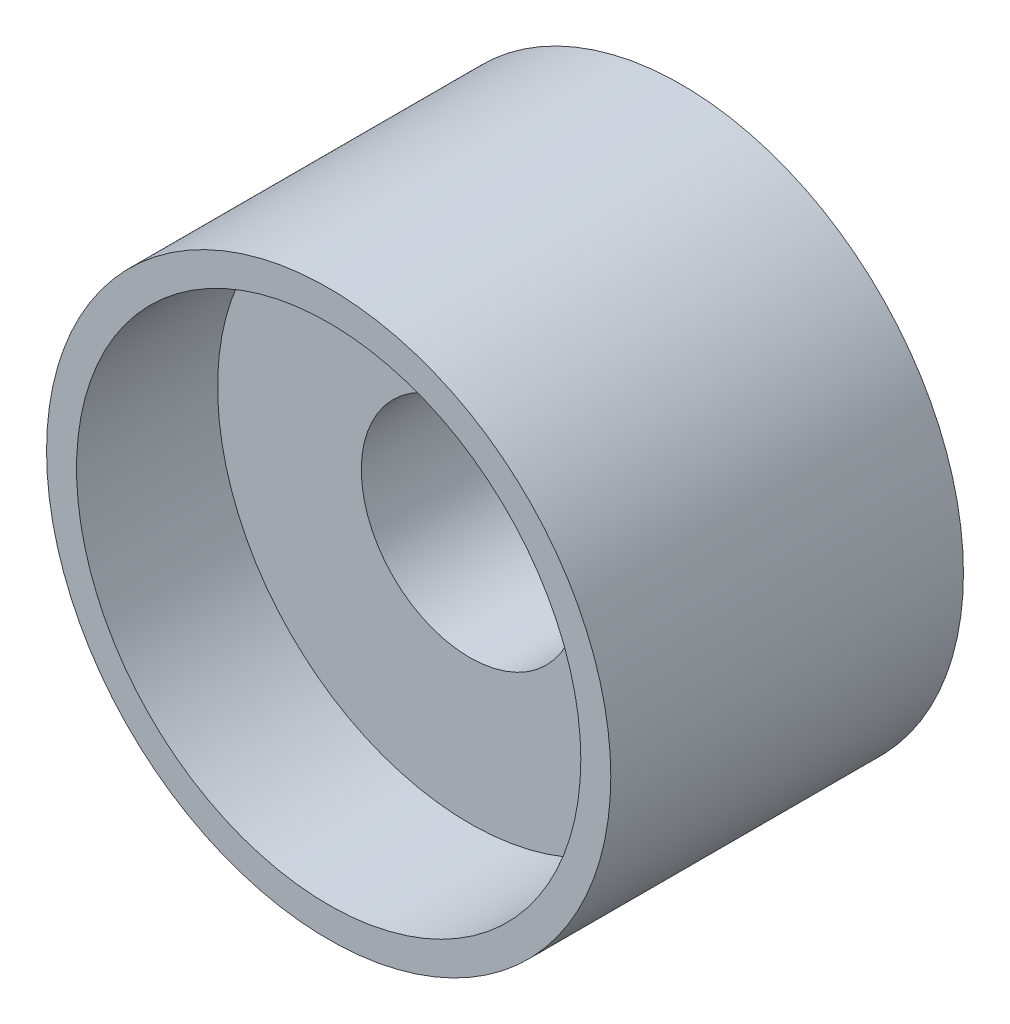
ISO-10303-21;
HEADER;
FILE_DESCRIPTION(('STEP AP214'),'2;1');
FILE_NAME('part.step','',(''),(''),'','','');
FILE_SCHEMA(('AUTOMOTIVE_DESIGN { 1 0 10303 214 1 1 1 1 }'));
ENDSEC;
DATA;
#1=APPLICATION_CONTEXT('core data for automotive mechanical design processes');
#2=APPLICATION_PROTOCOL_DEFINITION('international standard','automotive_design',2000,#1);
#3=PRODUCT_CONTEXT('',#1,'mechanical');
#4=PRODUCT('Part','Part','',(#3));
#5=PRODUCT_RELATED_PRODUCT_CATEGORY('part','',(#4));
#6=PRODUCT_DEFINITION_FORMATION('','',#4);
#7=PRODUCT_DEFINITION_CONTEXT('part definition',#1,'design');
#8=PRODUCT_DEFINITION('design','',#6,#7);
#9=PRODUCT_DEFINITION_SHAPE('','',#8);
#10=(LENGTH_UNIT() NAMED_UNIT(*) SI_UNIT(.MILLI.,.METRE.));
#11=(NAMED_UNIT(*) PLANE_ANGLE_UNIT() SI_UNIT($,.RADIAN.));
#12=(NAMED_UNIT(*) SI_UNIT($,.STERADIAN.) SOLID_ANGLE_UNIT());
#13=UNCERTAINTY_MEASURE_WITH_UNIT(LENGTH_MEASURE(1.E-05),#10,'distance_accuracy_value','');
#14=(GEOMETRIC_REPRESENTATION_CONTEXT(3) GLOBAL_UNCERTAINTY_ASSIGNED_CONTEXT((#13)) GLOBAL_UNIT_ASSIGNED_CONTEXT((#10,
#11,#12)) REPRESENTATION_CONTEXT('',''));
#15=CARTESIAN_POINT('',(0.,0.,0.));
#16=DIRECTION('',(0.,0.,1.));
#17=DIRECTION('',(1.,0.,0.));
#18=AXIS2_PLACEMENT_3D('',#15,#16,#17);
#19=CARTESIAN_POINT('',(0.,0.,20.));
#20=DIRECTION('',(0.,0.,-1.));
#21=DIRECTION('',(-1.,0.,0.));
#22=AXIS2_PLACEMENT_3D('',#19,#20,#21);
#23=CYLINDRICAL_SURFACE('',#22,6.15);
#24=CARTESIAN_POINT('',(0.,0.,0.));
#25=DIRECTION('',(0.,0.,1.));
#26=DIRECTION('',(1.,0.,0.));
#27=AXIS2_PLACEMENT_3D('',#24,#25,#26);
#28=CIRCLE('',#27,6.15);
#29=CARTESIAN_POINT('',(6.15,0.,0.));
#30=VERTEX_POINT('',#29);
#31=EDGE_CURVE('E44',#30,#30,#28,.T.);
#32=ORIENTED_EDGE('',*,*,#31,.F.);
#33=EDGE_LOOP('',(#32));
#34=FACE_BOUND('',#33,.T.);
#35=CARTESIAN_POINT('',(0.,0.,12.));
#36=DIRECTION('',(0.,0.,1.));
#37=DIRECTION('',(1.,0.,0.));
#38=AXIS2_PLACEMENT_3D('',#35,#36,#37);
#39=CIRCLE('',#38,6.15);
#40=CARTESIAN_POINT('',(6.15,0.,12.));
#41=VERTEX_POINT('',#40);
#42=EDGE_CURVE('E35',#41,#41,#39,.T.);
#43=ORIENTED_EDGE('',*,*,#42,.T.);
#44=EDGE_LOOP('',(#43));
#45=FACE_BOUND('',#44,.T.);
#46=ADVANCED_FACE('F31',(#34,#45),#23,.F.);
#47=CARTESIAN_POINT('',(0.,0.,20.));
#48=DIRECTION('',(0.,0.,1.));
#49=DIRECTION('',(1.,0.,0.));
#50=AXIS2_PLACEMENT_3D('',#47,#48,#49);
#51=PLANE('',#50);
#52=CARTESIAN_POINT('',(0.,0.,20.));
#53=DIRECTION('',(0.,0.,1.));
#54=DIRECTION('',(1.,0.,0.));
#55=AXIS2_PLACEMENT_3D('',#52,#53,#54);
#56=CIRCLE('',#55,14.3);
#57=CARTESIAN_POINT('',(14.3,0.,20.));
#58=VERTEX_POINT('',#57);
#59=EDGE_CURVE('E48',#58,#58,#56,.T.);
#60=ORIENTED_EDGE('',*,*,#59,.F.);
#61=EDGE_LOOP('',(#60));
#62=FACE_BOUND('',#61,.T.);
#63=CARTESIAN_POINT('',(0.,0.,20.));
#64=DIRECTION('',(0.,0.,1.));
#65=DIRECTION('',(1.,0.,0.));
#66=AXIS2_PLACEMENT_3D('',#63,#64,#65);
#67=CIRCLE('',#66,16.);
#68=CARTESIAN_POINT('',(16.,0.,20.));
#69=VERTEX_POINT('',#68);
#70=EDGE_CURVE('E10',#69,#69,#67,.T.);
#71=ORIENTED_EDGE('',*,*,#70,.T.);
#72=EDGE_LOOP('',(#71));
#73=FACE_BOUND('',#72,.T.);
#74=ADVANCED_FACE('F69',(#62,#73),#51,.T.);
#75=CARTESIAN_POINT('',(0.,0.,0.));
#76=DIRECTION('',(0.,0.,1.));
#77=DIRECTION('',(1.,0.,0.));
#78=AXIS2_PLACEMENT_3D('',#75,#76,#77);
#79=PLANE('',#78);
#80=CARTESIAN_POINT('',(0.,0.,0.));
#81=DIRECTION('',(0.,0.,1.));
#82=DIRECTION('',(1.,0.,0.));
#83=AXIS2_PLACEMENT_3D('',#80,#81,#82);
#84=CIRCLE('',#83,16.);
#85=CARTESIAN_POINT('',(16.,0.,0.));
#86=VERTEX_POINT('',#85);
#87=EDGE_CURVE('E39',#86,#86,#84,.T.);
#88=ORIENTED_EDGE('',*,*,#87,.F.);
#89=EDGE_LOOP('',(#88));
#90=FACE_BOUND('',#89,.T.);
#91=ORIENTED_EDGE('',*,*,#31,.T.);
#92=EDGE_LOOP('',(#91));
#93=FACE_BOUND('',#92,.T.);
#94=ADVANCED_FACE('F75',(#90,#93),#79,.F.);
#95=CARTESIAN_POINT('',(0.,0.,20.));
#96=DIRECTION('',(0.,0.,-1.));
#97=DIRECTION('',(-1.,0.,0.));
#98=AXIS2_PLACEMENT_3D('',#95,#96,#97);
#99=CYLINDRICAL_SURFACE('',#98,16.);
#100=ORIENTED_EDGE('',*,*,#70,.F.);
#101=EDGE_LOOP('',(#100));
#102=FACE_BOUND('',#101,.T.);
#103=ORIENTED_EDGE('',*,*,#87,.T.);
#104=EDGE_LOOP('',(#103));
#105=FACE_BOUND('',#104,.T.);
#106=ADVANCED_FACE('F33',(#102,#105),#99,.T.);
#107=CARTESIAN_POINT('',(0.,0.,12.));
#108=DIRECTION('',(0.,0.,1.));
#109=DIRECTION('',(1.,0.,0.));
#110=AXIS2_PLACEMENT_3D('',#107,#108,#109);
#111=CYLINDRICAL_SURFACE('',#110,14.3);
#112=CARTESIAN_POINT('',(0.,0.,12.));
#113=DIRECTION('',(0.,0.,1.));
#114=DIRECTION('',(1.,0.,0.));
#115=AXIS2_PLACEMENT_3D('',#112,#113,#114);
#116=CIRCLE('',#115,14.3);
#117=CARTESIAN_POINT('',(14.3,0.,12.));
#118=VERTEX_POINT('',#117);
#119=EDGE_CURVE('E51',#118,#118,#116,.T.);
#120=ORIENTED_EDGE('',*,*,#119,.F.);
#121=EDGE_LOOP('',(#120));
#122=FACE_BOUND('',#121,.T.);
#123=ORIENTED_EDGE('',*,*,#59,.T.);
#124=EDGE_LOOP('',(#123));
#125=FACE_BOUND('',#124,.T.);
#126=ADVANCED_FACE('F61',(#122,#125),#111,.F.);
#127=CARTESIAN_POINT('',(0.,0.,12.));
#128=DIRECTION('',(0.,0.,1.));
#129=DIRECTION('',(1.,0.,0.));
#130=AXIS2_PLACEMENT_3D('',#127,#128,#129);
#131=PLANE('',#130);
#132=ORIENTED_EDGE('',*,*,#42,.F.);
#133=EDGE_LOOP('',(#132));
#134=FACE_BOUND('',#133,.T.);
#135=ORIENTED_EDGE('',*,*,#119,.T.);
#136=EDGE_LOOP('',(#135));
#137=FACE_BOUND('',#136,.T.);
#138=ADVANCED_FACE('F59',(#134,#137),#131,.T.);
#139=CLOSED_SHELL('',(#46,#74,#94,#106,#126,#138));
#140=MANIFOLD_SOLID_BREP('B2',#139);
#141=ADVANCED_BREP_SHAPE_REPRESENTATION('',(#18,#140),#14);
#142=SHAPE_DEFINITION_REPRESENTATION(#9,#141);
ENDSEC;
END-ISO-10303-21;
